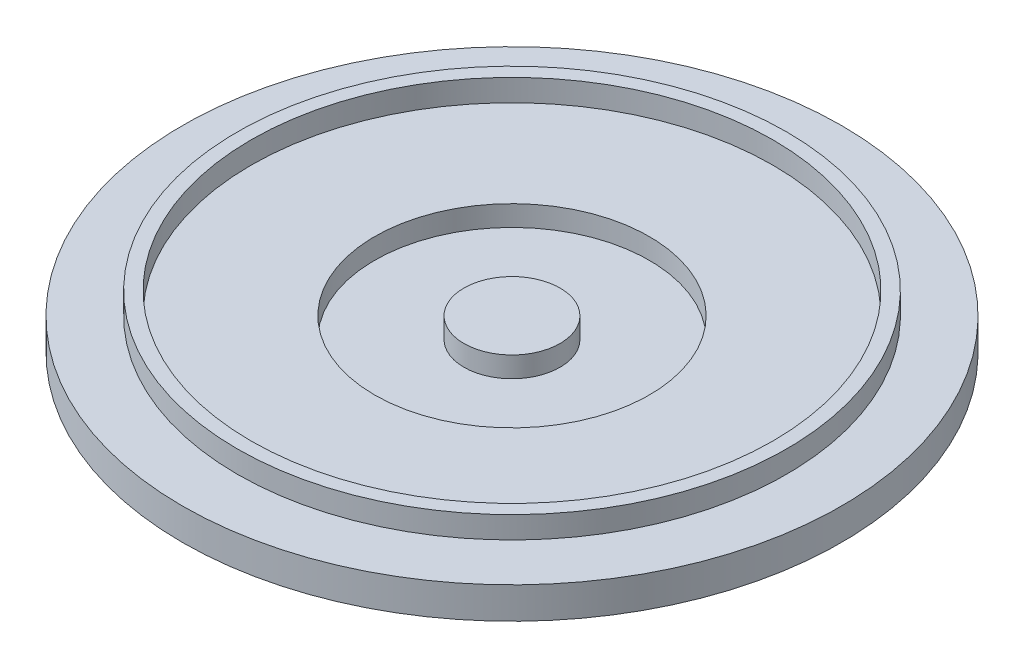
ISO-10303-21;
HEADER;
FILE_DESCRIPTION(('STEP AP214'),'2;1');
FILE_NAME('part.step','',(''),(''),'','','');
FILE_SCHEMA(('AUTOMOTIVE_DESIGN { 1 0 10303 214 1 1 1 1 }'));
ENDSEC;
DATA;
#1=APPLICATION_CONTEXT('core data for automotive mechanical design processes');
#2=APPLICATION_PROTOCOL_DEFINITION('international standard','automotive_design',2000,#1);
#3=PRODUCT_CONTEXT('',#1,'mechanical');
#4=PRODUCT('Part','Part','',(#3));
#5=PRODUCT_RELATED_PRODUCT_CATEGORY('part','',(#4));
#6=PRODUCT_DEFINITION_FORMATION('','',#4);
#7=PRODUCT_DEFINITION_CONTEXT('part definition',#1,'design');
#8=PRODUCT_DEFINITION('design','',#6,#7);
#9=PRODUCT_DEFINITION_SHAPE('','',#8);
#10=(LENGTH_UNIT() NAMED_UNIT(*) SI_UNIT(.MILLI.,.METRE.));
#11=(NAMED_UNIT(*) PLANE_ANGLE_UNIT() SI_UNIT($,.RADIAN.));
#12=(NAMED_UNIT(*) SI_UNIT($,.STERADIAN.) SOLID_ANGLE_UNIT());
#13=UNCERTAINTY_MEASURE_WITH_UNIT(LENGTH_MEASURE(1.E-05),#10,'distance_accuracy_value','');
#14=(GEOMETRIC_REPRESENTATION_CONTEXT(3) GLOBAL_UNCERTAINTY_ASSIGNED_CONTEXT((#13)) GLOBAL_UNIT_ASSIGNED_CONTEXT((#10,
#11,#12)) REPRESENTATION_CONTEXT('',''));
#15=CARTESIAN_POINT('',(0.,0.,0.));
#16=DIRECTION('',(0.,0.,1.));
#17=DIRECTION('',(1.,0.,0.));
#18=AXIS2_PLACEMENT_3D('',#15,#16,#17);
#19=CARTESIAN_POINT('',(0.,2.3,0.));
#20=DIRECTION('',(0.,1.,0.));
#21=DIRECTION('',(0.,0.,1.));
#22=AXIS2_PLACEMENT_3D('',#19,#20,#21);
#23=PLANE('',#22);
#24=CARTESIAN_POINT('',(0.,2.3,0.));
#25=DIRECTION('',(0.,1.,0.));
#26=DIRECTION('',(0.,0.,1.));
#27=AXIS2_PLACEMENT_3D('',#24,#25,#26);
#28=CIRCLE('',#27,10.);
#29=CARTESIAN_POINT('',(0.,2.3,10.));
#30=VERTEX_POINT('',#29);
#31=EDGE_CURVE('E68',#30,#30,#28,.T.);
#32=ORIENTED_EDGE('',*,*,#31,.F.);
#33=EDGE_LOOP('',(#32));
#34=FACE_BOUND('',#33,.T.);
#35=CARTESIAN_POINT('',(0.,2.3,0.));
#36=DIRECTION('',(0.,1.,0.));
#37=DIRECTION('',(0.,0.,1.));
#38=AXIS2_PLACEMENT_3D('',#35,#36,#37);
#39=CIRCLE('',#38,19.);
#40=CARTESIAN_POINT('',(0.,2.3,19.));
#41=VERTEX_POINT('',#40);
#42=EDGE_CURVE('E10',#41,#41,#39,.F.);
#43=ORIENTED_EDGE('',*,*,#42,.F.);
#44=EDGE_LOOP('',(#43));
#45=FACE_BOUND('',#44,.T.);
#46=ADVANCED_FACE('F44',(#34,#45),#23,.T.);
#47=CARTESIAN_POINT('',(0.,0.8,0.));
#48=DIRECTION('',(0.,1.,0.));
#49=DIRECTION('',(0.,0.,1.));
#50=AXIS2_PLACEMENT_3D('',#47,#48,#49);
#51=CYLINDRICAL_SURFACE('',#50,10.);
#52=CARTESIAN_POINT('',(0.,0.8,0.));
#53=DIRECTION('',(0.,1.,0.));
#54=DIRECTION('',(0.,0.,1.));
#55=AXIS2_PLACEMENT_3D('',#52,#53,#54);
#56=CIRCLE('',#55,10.);
#57=CARTESIAN_POINT('',(0.,0.8,10.));
#58=VERTEX_POINT('',#57);
#59=EDGE_CURVE('E63',#58,#58,#56,.T.);
#60=ORIENTED_EDGE('',*,*,#59,.F.);
#61=EDGE_LOOP('',(#60));
#62=FACE_BOUND('',#61,.T.);
#63=ORIENTED_EDGE('',*,*,#31,.T.);
#64=EDGE_LOOP('',(#63));
#65=FACE_BOUND('',#64,.T.);
#66=ADVANCED_FACE('F111',(#62,#65),#51,.F.);
#67=CARTESIAN_POINT('',(0.,0.8,0.));
#68=DIRECTION('',(0.,1.,0.));
#69=DIRECTION('',(0.,0.,1.));
#70=AXIS2_PLACEMENT_3D('',#67,#68,#69);
#71=PLANE('',#70);
#72=CARTESIAN_POINT('',(0.,0.8,0.));
#73=DIRECTION('',(0.,1.,0.));
#74=DIRECTION('',(0.,0.,1.));
#75=AXIS2_PLACEMENT_3D('',#72,#73,#74);
#76=CIRCLE('',#75,3.5);
#77=CARTESIAN_POINT('',(0.,0.8,3.5));
#78=VERTEX_POINT('',#77);
#79=EDGE_CURVE('E69',#78,#78,#76,.T.);
#80=ORIENTED_EDGE('',*,*,#79,.F.);
#81=EDGE_LOOP('',(#80));
#82=FACE_BOUND('',#81,.T.);
#83=ORIENTED_EDGE('',*,*,#59,.T.);
#84=EDGE_LOOP('',(#83));
#85=FACE_BOUND('',#84,.T.);
#86=ADVANCED_FACE('F118',(#82,#85),#71,.T.);
#87=CARTESIAN_POINT('',(0.,0.8,0.));
#88=DIRECTION('',(0.,1.,0.));
#89=DIRECTION('',(0.,0.,1.));
#90=AXIS2_PLACEMENT_3D('',#87,#88,#89);
#91=CYLINDRICAL_SURFACE('',#90,3.5);
#92=ORIENTED_EDGE('',*,*,#79,.T.);
#93=EDGE_LOOP('',(#92));
#94=FACE_BOUND('',#93,.T.);
#95=CARTESIAN_POINT('',(0.,2.3,0.));
#96=DIRECTION('',(0.,1.,0.));
#97=DIRECTION('',(0.,0.,1.));
#98=AXIS2_PLACEMENT_3D('',#95,#96,#97);
#99=CIRCLE('',#98,3.5);
#100=CARTESIAN_POINT('',(0.,2.3,3.5));
#101=VERTEX_POINT('',#100);
#102=EDGE_CURVE('E74',#101,#101,#99,.T.);
#103=ORIENTED_EDGE('',*,*,#102,.F.);
#104=EDGE_LOOP('',(#103));
#105=FACE_BOUND('',#104,.T.);
#106=ADVANCED_FACE('F108',(#94,#105),#91,.T.);
#107=ORIENTED_EDGE('',*,*,#102,.T.);
#108=EDGE_LOOP('',(#107));
#109=FACE_BOUND('',#108,.T.);
#110=ADVANCED_FACE('F97',(#109),#23,.T.);
#111=CARTESIAN_POINT('',(0.,3.9,0.));
#112=DIRECTION('',(0.,1.,0.));
#113=DIRECTION('',(0.,0.,1.));
#114=AXIS2_PLACEMENT_3D('',#111,#112,#113);
#115=PLANE('',#114);
#116=CARTESIAN_POINT('',(0.,3.9,0.));
#117=DIRECTION('',(0.,1.,0.));
#118=DIRECTION('',(0.,0.,1.));
#119=AXIS2_PLACEMENT_3D('',#116,#117,#118);
#120=CIRCLE('',#119,20.);
#121=CARTESIAN_POINT('',(0.,3.9,20.));
#122=VERTEX_POINT('',#121);
#123=EDGE_CURVE('E80',#122,#122,#120,.T.);
#124=ORIENTED_EDGE('',*,*,#123,.T.);
#125=EDGE_LOOP('',(#124));
#126=FACE_BOUND('',#125,.T.);
#127=CARTESIAN_POINT('',(0.,3.9,0.));
#128=DIRECTION('',(0.,1.,0.));
#129=DIRECTION('',(0.,0.,1.));
#130=AXIS2_PLACEMENT_3D('',#127,#128,#129);
#131=CIRCLE('',#130,19.);
#132=CARTESIAN_POINT('',(0.,3.9,19.));
#133=VERTEX_POINT('',#132);
#134=EDGE_CURVE('E88',#133,#133,#131,.T.);
#135=ORIENTED_EDGE('',*,*,#134,.F.);
#136=EDGE_LOOP('',(#135));
#137=FACE_BOUND('',#136,.T.);
#138=ADVANCED_FACE('F96',(#126,#137),#115,.T.);
#139=CARTESIAN_POINT('',(0.,3.9,0.));
#140=DIRECTION('',(0.,-1.,0.));
#141=DIRECTION('',(0.,0.,-1.));
#142=AXIS2_PLACEMENT_3D('',#139,#140,#141);
#143=CYLINDRICAL_SURFACE('',#142,20.);
#144=ORIENTED_EDGE('',*,*,#123,.F.);
#145=EDGE_LOOP('',(#144));
#146=FACE_BOUND('',#145,.T.);
#147=CARTESIAN_POINT('',(0.,2.3,0.));
#148=DIRECTION('',(0.,1.,0.));
#149=DIRECTION('',(0.,0.,1.));
#150=AXIS2_PLACEMENT_3D('',#147,#148,#149);
#151=CIRCLE('',#150,20.);
#152=CARTESIAN_POINT('',(0.,2.3,20.));
#153=VERTEX_POINT('',#152);
#154=EDGE_CURVE('E85',#153,#153,#151,.T.);
#155=ORIENTED_EDGE('',*,*,#154,.T.);
#156=EDGE_LOOP('',(#155));
#157=FACE_BOUND('',#156,.T.);
#158=ADVANCED_FACE('F98',(#146,#157),#143,.T.);
#159=CARTESIAN_POINT('',(0.,3.9,0.));
#160=DIRECTION('',(0.,-1.,0.));
#161=DIRECTION('',(0.,0.,-1.));
#162=AXIS2_PLACEMENT_3D('',#159,#160,#161);
#163=CYLINDRICAL_SURFACE('',#162,19.);
#164=ORIENTED_EDGE('',*,*,#134,.T.);
#165=EDGE_LOOP('',(#164));
#166=FACE_BOUND('',#165,.T.);
#167=ORIENTED_EDGE('',*,*,#42,.T.);
#168=EDGE_LOOP('',(#167));
#169=FACE_BOUND('',#168,.T.);
#170=ADVANCED_FACE('F94',(#166,#169),#163,.F.);
#171=CARTESIAN_POINT('',(0.,0.,0.));
#172=DIRECTION('',(0.,1.,0.));
#173=DIRECTION('',(0.,0.,1.));
#174=AXIS2_PLACEMENT_3D('',#171,#172,#173);
#175=PLANE('',#174);
#176=CARTESIAN_POINT('',(0.,0.,0.));
#177=DIRECTION('',(0.,1.,0.));
#178=DIRECTION('',(0.,0.,1.));
#179=AXIS2_PLACEMENT_3D('',#176,#177,#178);
#180=CIRCLE('',#179,24.);
#181=CARTESIAN_POINT('',(0.,0.,24.));
#182=VERTEX_POINT('',#181);
#183=EDGE_CURVE('E59',#182,#182,#180,.T.);
#184=ORIENTED_EDGE('',*,*,#183,.F.);
#185=EDGE_LOOP('',(#184));
#186=FACE_BOUND('',#185,.T.);
#187=ADVANCED_FACE('F128',(#186),#175,.F.);
#188=CARTESIAN_POINT('',(0.,2.3,0.));
#189=DIRECTION('',(0.,-1.,0.));
#190=DIRECTION('',(0.,0.,-1.));
#191=AXIS2_PLACEMENT_3D('',#188,#189,#190);
#192=CYLINDRICAL_SURFACE('',#191,24.);
#193=CARTESIAN_POINT('',(0.,2.3,0.));
#194=DIRECTION('',(0.,1.,0.));
#195=DIRECTION('',(0.,0.,1.));
#196=AXIS2_PLACEMENT_3D('',#193,#194,#195);
#197=CIRCLE('',#196,24.);
#198=CARTESIAN_POINT('',(0.,2.3,24.));
#199=VERTEX_POINT('',#198);
#200=EDGE_CURVE('E52',#199,#199,#197,.T.);
#201=ORIENTED_EDGE('',*,*,#200,.F.);
#202=EDGE_LOOP('',(#201));
#203=FACE_BOUND('',#202,.T.);
#204=ORIENTED_EDGE('',*,*,#183,.T.);
#205=EDGE_LOOP('',(#204));
#206=FACE_BOUND('',#205,.T.);
#207=ADVANCED_FACE('F50',(#203,#206),#192,.T.);
#208=ORIENTED_EDGE('',*,*,#154,.F.);
#209=EDGE_LOOP('',(#208));
#210=FACE_BOUND('',#209,.T.);
#211=ORIENTED_EDGE('',*,*,#200,.T.);
#212=EDGE_LOOP('',(#211));
#213=FACE_BOUND('',#212,.T.);
#214=ADVANCED_FACE('F115',(#210,#213),#23,.T.);
#215=CLOSED_SHELL('',(#46,#66,#86,#106,#110,#138,#158,#170,#187,#207,#214));
#216=MANIFOLD_SOLID_BREP('B2',#215);
#217=ADVANCED_BREP_SHAPE_REPRESENTATION('',(#18,#216),#14);
#218=SHAPE_DEFINITION_REPRESENTATION(#9,#217);
ENDSEC;
END-ISO-10303-21;
